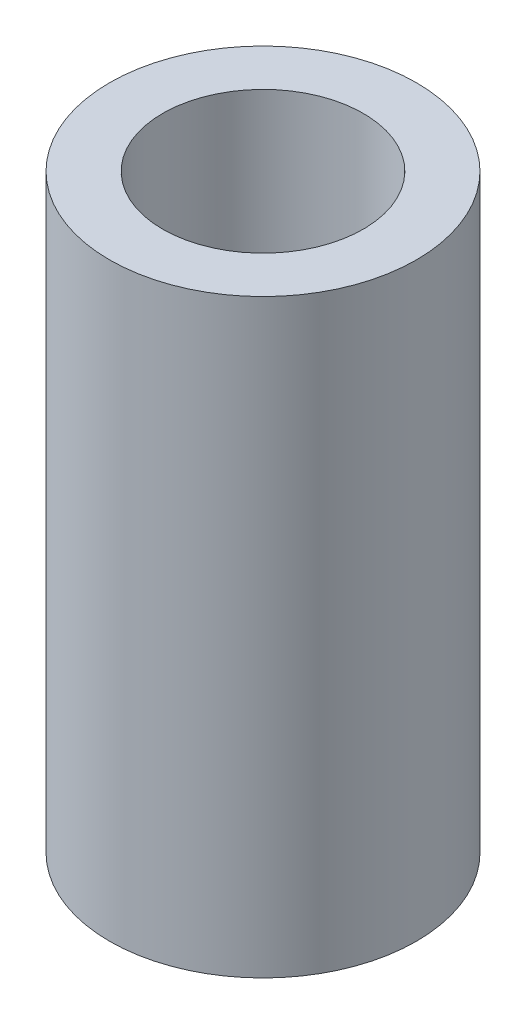
ISO-10303-21;
HEADER;
FILE_DESCRIPTION(('STEP AP214'),'2;1');
FILE_NAME('part.step','',(''),(''),'','','');
FILE_SCHEMA(('AUTOMOTIVE_DESIGN { 1 0 10303 214 1 1 1 1 }'));
ENDSEC;
DATA;
#1=APPLICATION_CONTEXT('core data for automotive mechanical design processes');
#2=APPLICATION_PROTOCOL_DEFINITION('international standard','automotive_design',2000,#1);
#3=PRODUCT_CONTEXT('',#1,'mechanical');
#4=PRODUCT('Part','Part','',(#3));
#5=PRODUCT_RELATED_PRODUCT_CATEGORY('part','',(#4));
#6=PRODUCT_DEFINITION_FORMATION('','',#4);
#7=PRODUCT_DEFINITION_CONTEXT('part definition',#1,'design');
#8=PRODUCT_DEFINITION('design','',#6,#7);
#9=PRODUCT_DEFINITION_SHAPE('','',#8);
#10=(LENGTH_UNIT() NAMED_UNIT(*) SI_UNIT(.MILLI.,.METRE.));
#11=(NAMED_UNIT(*) PLANE_ANGLE_UNIT() SI_UNIT($,.RADIAN.));
#12=(NAMED_UNIT(*) SI_UNIT($,.STERADIAN.) SOLID_ANGLE_UNIT());
#13=UNCERTAINTY_MEASURE_WITH_UNIT(LENGTH_MEASURE(1.E-05),#10,'distance_accuracy_value','');
#14=(GEOMETRIC_REPRESENTATION_CONTEXT(3) GLOBAL_UNCERTAINTY_ASSIGNED_CONTEXT((#13)) GLOBAL_UNIT_ASSIGNED_CONTEXT((#10,
#11,#12)) REPRESENTATION_CONTEXT('',''));
#15=CARTESIAN_POINT('',(0.,0.,0.));
#16=DIRECTION('',(0.,0.,1.));
#17=DIRECTION('',(1.,0.,0.));
#18=AXIS2_PLACEMENT_3D('',#15,#16,#17);
#19=CARTESIAN_POINT('',(0.,25.,0.));
#20=DIRECTION('',(0.,1.,0.));
#21=DIRECTION('',(0.,0.,1.));
#22=AXIS2_PLACEMENT_3D('',#19,#20,#21);
#23=PLANE('',#22);
#24=CARTESIAN_POINT('',(0.,25.,0.));
#25=DIRECTION('',(0.,1.,0.));
#26=DIRECTION('',(0.,0.,1.));
#27=AXIS2_PLACEMENT_3D('',#24,#25,#26);
#28=CIRCLE('',#27,6.5);
#29=CARTESIAN_POINT('',(0.,25.,6.5));
#30=VERTEX_POINT('',#29);
#31=EDGE_CURVE('E10',#30,#30,#28,.T.);
#32=ORIENTED_EDGE('',*,*,#31,.T.);
#33=EDGE_LOOP('',(#32));
#34=FACE_BOUND('',#33,.T.);
#35=CARTESIAN_POINT('',(0.,25.,0.));
#36=DIRECTION('',(0.,1.,0.));
#37=DIRECTION('',(0.,0.,1.));
#38=AXIS2_PLACEMENT_3D('',#35,#36,#37);
#39=CIRCLE('',#38,4.25);
#40=CARTESIAN_POINT('',(0.,25.,4.25));
#41=VERTEX_POINT('',#40);
#42=EDGE_CURVE('E43',#41,#41,#39,.T.);
#43=ORIENTED_EDGE('',*,*,#42,.F.);
#44=EDGE_LOOP('',(#43));
#45=FACE_BOUND('',#44,.T.);
#46=ADVANCED_FACE('F32',(#34,#45),#23,.T.);
#47=CARTESIAN_POINT('',(0.,0.,0.));
#48=DIRECTION('',(0.,1.,0.));
#49=DIRECTION('',(0.,0.,1.));
#50=AXIS2_PLACEMENT_3D('',#47,#48,#49);
#51=PLANE('',#50);
#52=CARTESIAN_POINT('',(0.,0.,0.));
#53=DIRECTION('',(0.,1.,0.));
#54=DIRECTION('',(0.,0.,1.));
#55=AXIS2_PLACEMENT_3D('',#52,#53,#54);
#56=CIRCLE('',#55,6.5);
#57=CARTESIAN_POINT('',(0.,0.,6.5));
#58=VERTEX_POINT('',#57);
#59=EDGE_CURVE('E36',#58,#58,#56,.T.);
#60=ORIENTED_EDGE('',*,*,#59,.F.);
#61=EDGE_LOOP('',(#60));
#62=FACE_BOUND('',#61,.T.);
#63=CARTESIAN_POINT('',(0.,0.,0.));
#64=DIRECTION('',(0.,1.,0.));
#65=DIRECTION('',(0.,0.,1.));
#66=AXIS2_PLACEMENT_3D('',#63,#64,#65);
#67=CIRCLE('',#66,4.25);
#68=CARTESIAN_POINT('',(0.,0.,4.25));
#69=VERTEX_POINT('',#68);
#70=EDGE_CURVE('E45',#69,#69,#67,.T.);
#71=ORIENTED_EDGE('',*,*,#70,.T.);
#72=EDGE_LOOP('',(#71));
#73=FACE_BOUND('',#72,.T.);
#74=ADVANCED_FACE('F55',(#62,#73),#51,.F.);
#75=CARTESIAN_POINT('',(0.,25.,0.));
#76=DIRECTION('',(0.,-1.,0.));
#77=DIRECTION('',(0.,0.,-1.));
#78=AXIS2_PLACEMENT_3D('',#75,#76,#77);
#79=CYLINDRICAL_SURFACE('',#78,6.5);
#80=ORIENTED_EDGE('',*,*,#31,.F.);
#81=EDGE_LOOP('',(#80));
#82=FACE_BOUND('',#81,.T.);
#83=ORIENTED_EDGE('',*,*,#59,.T.);
#84=EDGE_LOOP('',(#83));
#85=FACE_BOUND('',#84,.T.);
#86=ADVANCED_FACE('F34',(#82,#85),#79,.T.);
#87=CARTESIAN_POINT('',(0.,25.,0.));
#88=DIRECTION('',(0.,-1.,0.));
#89=DIRECTION('',(0.,0.,-1.));
#90=AXIS2_PLACEMENT_3D('',#87,#88,#89);
#91=CYLINDRICAL_SURFACE('',#90,4.25);
#92=ORIENTED_EDGE('',*,*,#42,.T.);
#93=EDGE_LOOP('',(#92));
#94=FACE_BOUND('',#93,.T.);
#95=ORIENTED_EDGE('',*,*,#70,.F.);
#96=EDGE_LOOP('',(#95));
#97=FACE_BOUND('',#96,.T.);
#98=ADVANCED_FACE('F51',(#94,#97),#91,.F.);
#99=CLOSED_SHELL('',(#46,#74,#86,#98));
#100=MANIFOLD_SOLID_BREP('B2',#99);
#101=ADVANCED_BREP_SHAPE_REPRESENTATION('',(#18,#100),#14);
#102=SHAPE_DEFINITION_REPRESENTATION(#9,#101);
ENDSEC;
END-ISO-10303-21;
